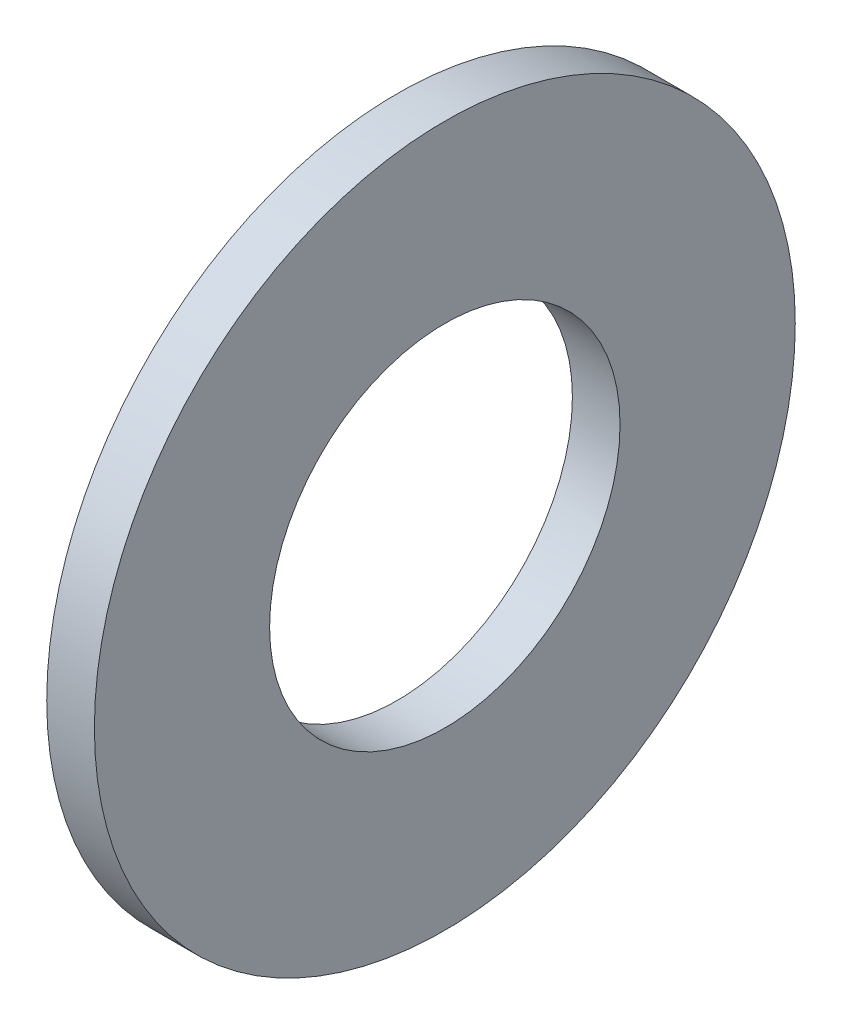
ISO-10303-21;
HEADER;
FILE_DESCRIPTION(('STEP AP214'),'2;1');
FILE_NAME('part.step','',(''),(''),'','','');
FILE_SCHEMA(('AUTOMOTIVE_DESIGN { 1 0 10303 214 1 1 1 1 }'));
ENDSEC;
DATA;
#1=APPLICATION_CONTEXT('core data for automotive mechanical design processes');
#2=APPLICATION_PROTOCOL_DEFINITION('international standard','automotive_design',2000,#1);
#3=PRODUCT_CONTEXT('',#1,'mechanical');
#4=PRODUCT('Part','Part','',(#3));
#5=PRODUCT_RELATED_PRODUCT_CATEGORY('part','',(#4));
#6=PRODUCT_DEFINITION_FORMATION('','',#4);
#7=PRODUCT_DEFINITION_CONTEXT('part definition',#1,'design');
#8=PRODUCT_DEFINITION('design','',#6,#7);
#9=PRODUCT_DEFINITION_SHAPE('','',#8);
#10=(LENGTH_UNIT() NAMED_UNIT(*) SI_UNIT(.MILLI.,.METRE.));
#11=(NAMED_UNIT(*) PLANE_ANGLE_UNIT() SI_UNIT($,.RADIAN.));
#12=(NAMED_UNIT(*) SI_UNIT($,.STERADIAN.) SOLID_ANGLE_UNIT());
#13=UNCERTAINTY_MEASURE_WITH_UNIT(LENGTH_MEASURE(1.E-05),#10,'distance_accuracy_value','');
#14=(GEOMETRIC_REPRESENTATION_CONTEXT(3) GLOBAL_UNCERTAINTY_ASSIGNED_CONTEXT((#13)) GLOBAL_UNIT_ASSIGNED_CONTEXT((#10,
#11,#12)) REPRESENTATION_CONTEXT('',''));
#15=CARTESIAN_POINT('',(0.,0.,0.));
#16=DIRECTION('',(0.,0.,1.));
#17=DIRECTION('',(1.,0.,0.));
#18=AXIS2_PLACEMENT_3D('',#15,#16,#17);
#19=CARTESIAN_POINT('',(0.8636,0.,0.));
#20=DIRECTION('',(1.,0.,0.));
#21=DIRECTION('',(0.,0.,-1.));
#22=AXIS2_PLACEMENT_3D('',#19,#20,#21);
#23=PLANE('',#22);
#24=CARTESIAN_POINT('',(0.8636,0.,0.));
#25=DIRECTION('',(1.,0.,0.));
#26=DIRECTION('',(0.,0.,-1.));
#27=AXIS2_PLACEMENT_3D('',#24,#25,#26);
#28=CIRCLE('',#27,6.35);
#29=CARTESIAN_POINT('',(0.8636,0.,-6.35));
#30=VERTEX_POINT('',#29);
#31=EDGE_CURVE('E10',#30,#30,#28,.T.);
#32=ORIENTED_EDGE('',*,*,#31,.T.);
#33=EDGE_LOOP('',(#32));
#34=FACE_BOUND('',#33,.T.);
#35=CARTESIAN_POINT('',(0.8636,0.,0.));
#36=DIRECTION('',(1.,0.,0.));
#37=DIRECTION('',(0.,0.,-1.));
#38=AXIS2_PLACEMENT_3D('',#35,#36,#37);
#39=CIRCLE('',#38,3.175);
#40=CARTESIAN_POINT('',(0.8636,0.,-3.175));
#41=VERTEX_POINT('',#40);
#42=EDGE_CURVE('E44',#41,#41,#39,.T.);
#43=ORIENTED_EDGE('',*,*,#42,.F.);
#44=EDGE_LOOP('',(#43));
#45=FACE_BOUND('',#44,.T.);
#46=ADVANCED_FACE('F33',(#34,#45),#23,.T.);
#47=CARTESIAN_POINT('',(0.,0.,0.));
#48=DIRECTION('',(1.,0.,0.));
#49=DIRECTION('',(0.,0.,-1.));
#50=AXIS2_PLACEMENT_3D('',#47,#48,#49);
#51=PLANE('',#50);
#52=CARTESIAN_POINT('',(0.,0.,0.));
#53=DIRECTION('',(1.,0.,0.));
#54=DIRECTION('',(0.,0.,-1.));
#55=AXIS2_PLACEMENT_3D('',#52,#53,#54);
#56=CIRCLE('',#55,6.35);
#57=CARTESIAN_POINT('',(0.,0.,-6.35));
#58=VERTEX_POINT('',#57);
#59=EDGE_CURVE('E37',#58,#58,#56,.T.);
#60=ORIENTED_EDGE('',*,*,#59,.F.);
#61=EDGE_LOOP('',(#60));
#62=FACE_BOUND('',#61,.T.);
#63=CARTESIAN_POINT('',(0.,0.,0.));
#64=DIRECTION('',(1.,0.,0.));
#65=DIRECTION('',(0.,0.,-1.));
#66=AXIS2_PLACEMENT_3D('',#63,#64,#65);
#67=CIRCLE('',#66,3.175);
#68=CARTESIAN_POINT('',(0.,0.,-3.175));
#69=VERTEX_POINT('',#68);
#70=EDGE_CURVE('E46',#69,#69,#67,.T.);
#71=ORIENTED_EDGE('',*,*,#70,.T.);
#72=EDGE_LOOP('',(#71));
#73=FACE_BOUND('',#72,.T.);
#74=ADVANCED_FACE('F56',(#62,#73),#51,.F.);
#75=CARTESIAN_POINT('',(0.8636,0.,0.));
#76=DIRECTION('',(-1.,0.,0.));
#77=DIRECTION('',(0.,0.,1.));
#78=AXIS2_PLACEMENT_3D('',#75,#76,#77);
#79=CYLINDRICAL_SURFACE('',#78,6.35);
#80=ORIENTED_EDGE('',*,*,#31,.F.);
#81=EDGE_LOOP('',(#80));
#82=FACE_BOUND('',#81,.T.);
#83=ORIENTED_EDGE('',*,*,#59,.T.);
#84=EDGE_LOOP('',(#83));
#85=FACE_BOUND('',#84,.T.);
#86=ADVANCED_FACE('F35',(#82,#85),#79,.T.);
#87=CARTESIAN_POINT('',(0.8636,0.,0.));
#88=DIRECTION('',(-1.,0.,0.));
#89=DIRECTION('',(0.,0.,1.));
#90=AXIS2_PLACEMENT_3D('',#87,#88,#89);
#91=CYLINDRICAL_SURFACE('',#90,3.175);
#92=ORIENTED_EDGE('',*,*,#42,.T.);
#93=EDGE_LOOP('',(#92));
#94=FACE_BOUND('',#93,.T.);
#95=ORIENTED_EDGE('',*,*,#70,.F.);
#96=EDGE_LOOP('',(#95));
#97=FACE_BOUND('',#96,.T.);
#98=ADVANCED_FACE('F52',(#94,#97),#91,.F.);
#99=CLOSED_SHELL('',(#46,#74,#86,#98));
#100=MANIFOLD_SOLID_BREP('B2',#99);
#101=ADVANCED_BREP_SHAPE_REPRESENTATION('',(#18,#100),#14);
#102=SHAPE_DEFINITION_REPRESENTATION(#9,#101);
ENDSEC;
END-ISO-10303-21;
